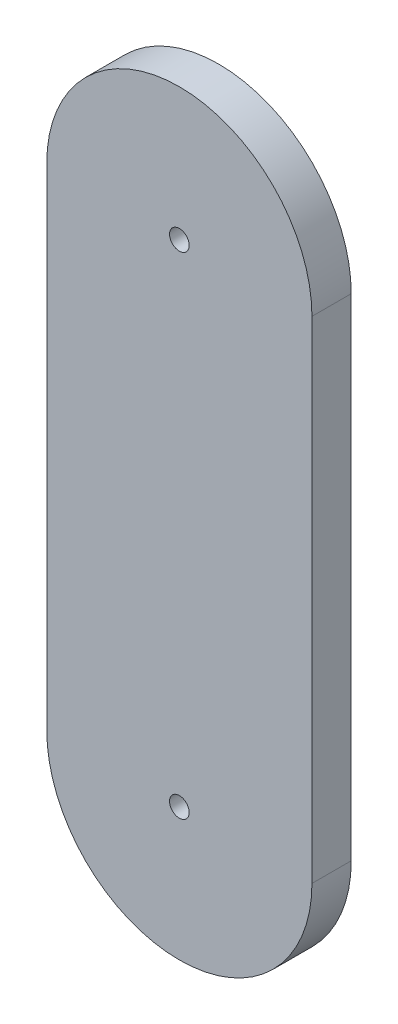
ISO-10303-21;
HEADER;
FILE_DESCRIPTION(('STEP AP214'),'2;1');
FILE_NAME('part.step','',(''),(''),'','','');
FILE_SCHEMA(('AUTOMOTIVE_DESIGN { 1 0 10303 214 1 1 1 1 }'));
ENDSEC;
DATA;
#1=APPLICATION_CONTEXT('core data for automotive mechanical design processes');
#2=APPLICATION_PROTOCOL_DEFINITION('international standard','automotive_design',2000,#1);
#3=PRODUCT_CONTEXT('',#1,'mechanical');
#4=PRODUCT('Part','Part','',(#3));
#5=PRODUCT_RELATED_PRODUCT_CATEGORY('part','',(#4));
#6=PRODUCT_DEFINITION_FORMATION('','',#4);
#7=PRODUCT_DEFINITION_CONTEXT('part definition',#1,'design');
#8=PRODUCT_DEFINITION('design','',#6,#7);
#9=PRODUCT_DEFINITION_SHAPE('','',#8);
#10=(LENGTH_UNIT() NAMED_UNIT(*) SI_UNIT(.MILLI.,.METRE.));
#11=(NAMED_UNIT(*) PLANE_ANGLE_UNIT() SI_UNIT($,.RADIAN.));
#12=(NAMED_UNIT(*) SI_UNIT($,.STERADIAN.) SOLID_ANGLE_UNIT());
#13=UNCERTAINTY_MEASURE_WITH_UNIT(LENGTH_MEASURE(1.E-05),#10,'distance_accuracy_value','');
#14=(GEOMETRIC_REPRESENTATION_CONTEXT(3) GLOBAL_UNCERTAINTY_ASSIGNED_CONTEXT((#13)) GLOBAL_UNIT_ASSIGNED_CONTEXT((#10,
#11,#12)) REPRESENTATION_CONTEXT('',''));
#15=CARTESIAN_POINT('',(0.,0.,0.));
#16=DIRECTION('',(0.,0.,1.));
#17=DIRECTION('',(1.,0.,0.));
#18=AXIS2_PLACEMENT_3D('',#15,#16,#17);
#19=CARTESIAN_POINT('',(0.,0.,20.));
#20=DIRECTION('',(0.,0.,1.));
#21=DIRECTION('',(1.,0.,0.));
#22=AXIS2_PLACEMENT_3D('',#19,#20,#21);
#23=PLANE('',#22);
#24=CARTESIAN_POINT('',(0.,250.,20.));
#25=DIRECTION('',(0.,0.,1.));
#26=DIRECTION('',(1.,0.,0.));
#27=AXIS2_PLACEMENT_3D('',#24,#25,#26);
#28=CIRCLE('',#27,5.);
#29=CARTESIAN_POINT('',(5.,250.,20.));
#30=VERTEX_POINT('',#29);
#31=EDGE_CURVE('E118',#30,#30,#28,.T.);
#32=ORIENTED_EDGE('',*,*,#31,.F.);
#33=EDGE_LOOP('',(#32));
#34=FACE_BOUND('',#33,.T.);
#35=CARTESIAN_POINT('',(0.,0.,20.));
#36=DIRECTION('',(0.,0.,1.));
#37=DIRECTION('',(1.,0.,0.));
#38=AXIS2_PLACEMENT_3D('',#35,#36,#37);
#39=CIRCLE('',#38,67.5);
#40=CARTESIAN_POINT('',(-67.5,0.,20.));
#41=VERTEX_POINT('',#40);
#42=CARTESIAN_POINT('',(67.5,0.,20.));
#43=VERTEX_POINT('',#42);
#44=EDGE_CURVE('E98',#41,#43,#39,.T.);
#45=ORIENTED_EDGE('',*,*,#44,.T.);
#46=DIRECTION('',(0.,1.,0.));
#47=VECTOR('',#46,1.);
#48=CARTESIAN_POINT('',(67.5,0.,20.));
#49=LINE('',#48,#47);
#50=CARTESIAN_POINT('',(67.5,250.,20.));
#51=VERTEX_POINT('',#50);
#52=EDGE_CURVE('E93',#43,#51,#49,.T.);
#53=ORIENTED_EDGE('',*,*,#52,.T.);
#54=CARTESIAN_POINT('',(0.,250.,20.));
#55=DIRECTION('',(0.,0.,1.));
#56=DIRECTION('',(1.,0.,0.));
#57=AXIS2_PLACEMENT_3D('',#54,#55,#56);
#58=CIRCLE('',#57,67.5);
#59=CARTESIAN_POINT('',(-67.5,250.,20.));
#60=VERTEX_POINT('',#59);
#61=EDGE_CURVE('E96',#51,#60,#58,.T.);
#62=ORIENTED_EDGE('',*,*,#61,.T.);
#63=DIRECTION('',(0.,-1.,0.));
#64=VECTOR('',#63,1.);
#65=CARTESIAN_POINT('',(-67.5,0.,20.));
#66=LINE('',#65,#64);
#67=EDGE_CURVE('E63',#60,#41,#66,.T.);
#68=ORIENTED_EDGE('',*,*,#67,.T.);
#69=EDGE_LOOP('',(#45,#53,#62,#68));
#70=FACE_BOUND('',#69,.T.);
#71=CARTESIAN_POINT('',(0.,0.,20.));
#72=DIRECTION('',(0.,0.,1.));
#73=DIRECTION('',(1.,0.,0.));
#74=AXIS2_PLACEMENT_3D('',#71,#72,#73);
#75=CIRCLE('',#74,5.);
#76=CARTESIAN_POINT('',(5.,0.,20.));
#77=VERTEX_POINT('',#76);
#78=EDGE_CURVE('E140',#77,#77,#75,.T.);
#79=ORIENTED_EDGE('',*,*,#78,.F.);
#80=EDGE_LOOP('',(#79));
#81=FACE_BOUND('',#80,.T.);
#82=ADVANCED_FACE('F45',(#34,#70,#81),#23,.T.);
#83=CARTESIAN_POINT('',(0.,0.,0.));
#84=DIRECTION('',(0.,0.,1.));
#85=DIRECTION('',(1.,0.,0.));
#86=AXIS2_PLACEMENT_3D('',#83,#84,#85);
#87=PLANE('',#86);
#88=CARTESIAN_POINT('',(0.,0.,0.));
#89=DIRECTION('',(0.,0.,1.));
#90=DIRECTION('',(1.,0.,0.));
#91=AXIS2_PLACEMENT_3D('',#88,#89,#90);
#92=CIRCLE('',#91,67.5);
#93=CARTESIAN_POINT('',(-67.5,0.,0.));
#94=VERTEX_POINT('',#93);
#95=CARTESIAN_POINT('',(67.5,0.,0.));
#96=VERTEX_POINT('',#95);
#97=EDGE_CURVE('E114',#94,#96,#92,.T.);
#98=ORIENTED_EDGE('',*,*,#97,.F.);
#99=DIRECTION('',(0.,-1.,0.));
#100=VECTOR('',#99,1.);
#101=CARTESIAN_POINT('',(-67.5,0.,0.));
#102=LINE('',#101,#100);
#103=CARTESIAN_POINT('',(-67.5,250.,0.));
#104=VERTEX_POINT('',#103);
#105=EDGE_CURVE('E86',#104,#94,#102,.T.);
#106=ORIENTED_EDGE('',*,*,#105,.F.);
#107=CARTESIAN_POINT('',(0.,250.,0.));
#108=DIRECTION('',(0.,0.,1.));
#109=DIRECTION('',(1.,0.,0.));
#110=AXIS2_PLACEMENT_3D('',#107,#108,#109);
#111=CIRCLE('',#110,67.5);
#112=CARTESIAN_POINT('',(67.5,250.,0.));
#113=VERTEX_POINT('',#112);
#114=EDGE_CURVE('E80',#113,#104,#111,.T.);
#115=ORIENTED_EDGE('',*,*,#114,.F.);
#116=DIRECTION('',(0.,1.,0.));
#117=VECTOR('',#116,1.);
#118=CARTESIAN_POINT('',(67.5,0.,0.));
#119=LINE('',#118,#117);
#120=EDGE_CURVE('E103',#96,#113,#119,.T.);
#121=ORIENTED_EDGE('',*,*,#120,.F.);
#122=EDGE_LOOP('',(#98,#106,#115,#121));
#123=FACE_BOUND('',#122,.T.);
#124=CARTESIAN_POINT('',(0.,250.,0.));
#125=DIRECTION('',(0.,0.,1.));
#126=DIRECTION('',(1.,0.,0.));
#127=AXIS2_PLACEMENT_3D('',#124,#125,#126);
#128=CIRCLE('',#127,5.);
#129=CARTESIAN_POINT('',(5.,250.,0.));
#130=VERTEX_POINT('',#129);
#131=EDGE_CURVE('E136',#130,#130,#128,.T.);
#132=ORIENTED_EDGE('',*,*,#131,.T.);
#133=EDGE_LOOP('',(#132));
#134=FACE_BOUND('',#133,.T.);
#135=CARTESIAN_POINT('',(0.,0.,0.));
#136=DIRECTION('',(0.,0.,1.));
#137=DIRECTION('',(1.,0.,0.));
#138=AXIS2_PLACEMENT_3D('',#135,#136,#137);
#139=CIRCLE('',#138,5.);
#140=CARTESIAN_POINT('',(5.,0.,0.));
#141=VERTEX_POINT('',#140);
#142=EDGE_CURVE('E144',#141,#141,#139,.T.);
#143=ORIENTED_EDGE('',*,*,#142,.T.);
#144=EDGE_LOOP('',(#143));
#145=FACE_BOUND('',#144,.T.);
#146=ADVANCED_FACE('F131',(#123,#134,#145),#87,.F.);
#147=CARTESIAN_POINT('',(0.,0.,20.));
#148=DIRECTION('',(0.,0.,-1.));
#149=DIRECTION('',(-1.,0.,0.));
#150=AXIS2_PLACEMENT_3D('',#147,#148,#149);
#151=CYLINDRICAL_SURFACE('',#150,67.5);
#152=ORIENTED_EDGE('',*,*,#97,.T.);
#153=DIRECTION('',(0.,0.,-1.));
#154=VECTOR('',#153,1.);
#155=CARTESIAN_POINT('',(67.5,0.,20.));
#156=LINE('',#155,#154);
#157=EDGE_CURVE('E11',#43,#96,#156,.T.);
#158=ORIENTED_EDGE('',*,*,#157,.F.);
#159=ORIENTED_EDGE('',*,*,#44,.F.);
#160=DIRECTION('',(0.,0.,-1.));
#161=VECTOR('',#160,1.);
#162=CARTESIAN_POINT('',(-67.5,0.,20.));
#163=LINE('',#162,#161);
#164=EDGE_CURVE('E110',#41,#94,#163,.T.);
#165=ORIENTED_EDGE('',*,*,#164,.T.);
#166=EDGE_LOOP('',(#152,#158,#159,#165));
#167=FACE_BOUND('',#166,.T.);
#168=ADVANCED_FACE('F47',(#167),#151,.T.);
#169=CARTESIAN_POINT('',(67.5,0.,20.));
#170=DIRECTION('',(-1.,0.,0.));
#171=DIRECTION('',(0.,0.,1.));
#172=AXIS2_PLACEMENT_3D('',#169,#170,#171);
#173=PLANE('',#172);
#174=ORIENTED_EDGE('',*,*,#120,.T.);
#175=DIRECTION('',(0.,0.,-1.));
#176=VECTOR('',#175,1.);
#177=CARTESIAN_POINT('',(67.5,250.,20.));
#178=LINE('',#177,#176);
#179=EDGE_CURVE('E55',#51,#113,#178,.T.);
#180=ORIENTED_EDGE('',*,*,#179,.F.);
#181=ORIENTED_EDGE('',*,*,#52,.F.);
#182=ORIENTED_EDGE('',*,*,#157,.T.);
#183=EDGE_LOOP('',(#174,#180,#181,#182));
#184=FACE_BOUND('',#183,.T.);
#185=ADVANCED_FACE('F102',(#184),#173,.F.);
#186=CARTESIAN_POINT('',(0.,250.,20.));
#187=DIRECTION('',(0.,0.,-1.));
#188=DIRECTION('',(-1.,0.,0.));
#189=AXIS2_PLACEMENT_3D('',#186,#187,#188);
#190=CYLINDRICAL_SURFACE('',#189,67.5);
#191=ORIENTED_EDGE('',*,*,#114,.T.);
#192=DIRECTION('',(0.,0.,-1.));
#193=VECTOR('',#192,1.);
#194=CARTESIAN_POINT('',(-67.5,250.,20.));
#195=LINE('',#194,#193);
#196=EDGE_CURVE('E105',#60,#104,#195,.T.);
#197=ORIENTED_EDGE('',*,*,#196,.F.);
#198=ORIENTED_EDGE('',*,*,#61,.F.);
#199=ORIENTED_EDGE('',*,*,#179,.T.);
#200=EDGE_LOOP('',(#191,#197,#198,#199));
#201=FACE_BOUND('',#200,.T.);
#202=ADVANCED_FACE('F106',(#201),#190,.T.);
#203=CARTESIAN_POINT('',(-67.5,0.,20.));
#204=DIRECTION('',(1.,0.,0.));
#205=DIRECTION('',(0.,0.,-1.));
#206=AXIS2_PLACEMENT_3D('',#203,#204,#205);
#207=PLANE('',#206);
#208=ORIENTED_EDGE('',*,*,#105,.T.);
#209=ORIENTED_EDGE('',*,*,#164,.F.);
#210=ORIENTED_EDGE('',*,*,#67,.F.);
#211=ORIENTED_EDGE('',*,*,#196,.T.);
#212=EDGE_LOOP('',(#208,#209,#210,#211));
#213=FACE_BOUND('',#212,.T.);
#214=ADVANCED_FACE('F128',(#213),#207,.F.);
#215=CARTESIAN_POINT('',(0.,250.,20.));
#216=DIRECTION('',(0.,0.,-1.));
#217=DIRECTION('',(-1.,0.,0.));
#218=AXIS2_PLACEMENT_3D('',#215,#216,#217);
#219=CYLINDRICAL_SURFACE('',#218,5.);
#220=ORIENTED_EDGE('',*,*,#31,.T.);
#221=EDGE_LOOP('',(#220));
#222=FACE_BOUND('',#221,.T.);
#223=ORIENTED_EDGE('',*,*,#131,.F.);
#224=EDGE_LOOP('',(#223));
#225=FACE_BOUND('',#224,.T.);
#226=ADVANCED_FACE('F163',(#222,#225),#219,.F.);
#227=CARTESIAN_POINT('',(0.,0.,20.));
#228=DIRECTION('',(0.,0.,-1.));
#229=DIRECTION('',(-1.,0.,0.));
#230=AXIS2_PLACEMENT_3D('',#227,#228,#229);
#231=CYLINDRICAL_SURFACE('',#230,5.);
#232=ORIENTED_EDGE('',*,*,#78,.T.);
#233=EDGE_LOOP('',(#232));
#234=FACE_BOUND('',#233,.T.);
#235=ORIENTED_EDGE('',*,*,#142,.F.);
#236=EDGE_LOOP('',(#235));
#237=FACE_BOUND('',#236,.T.);
#238=ADVANCED_FACE('F152',(#234,#237),#231,.F.);
#239=CLOSED_SHELL('',(#82,#146,#168,#185,#202,#214,#226,#238));
#240=MANIFOLD_SOLID_BREP('B2',#239);
#241=ADVANCED_BREP_SHAPE_REPRESENTATION('',(#18,#240),#14);
#242=SHAPE_DEFINITION_REPRESENTATION(#9,#241);
ENDSEC;
END-ISO-10303-21;
